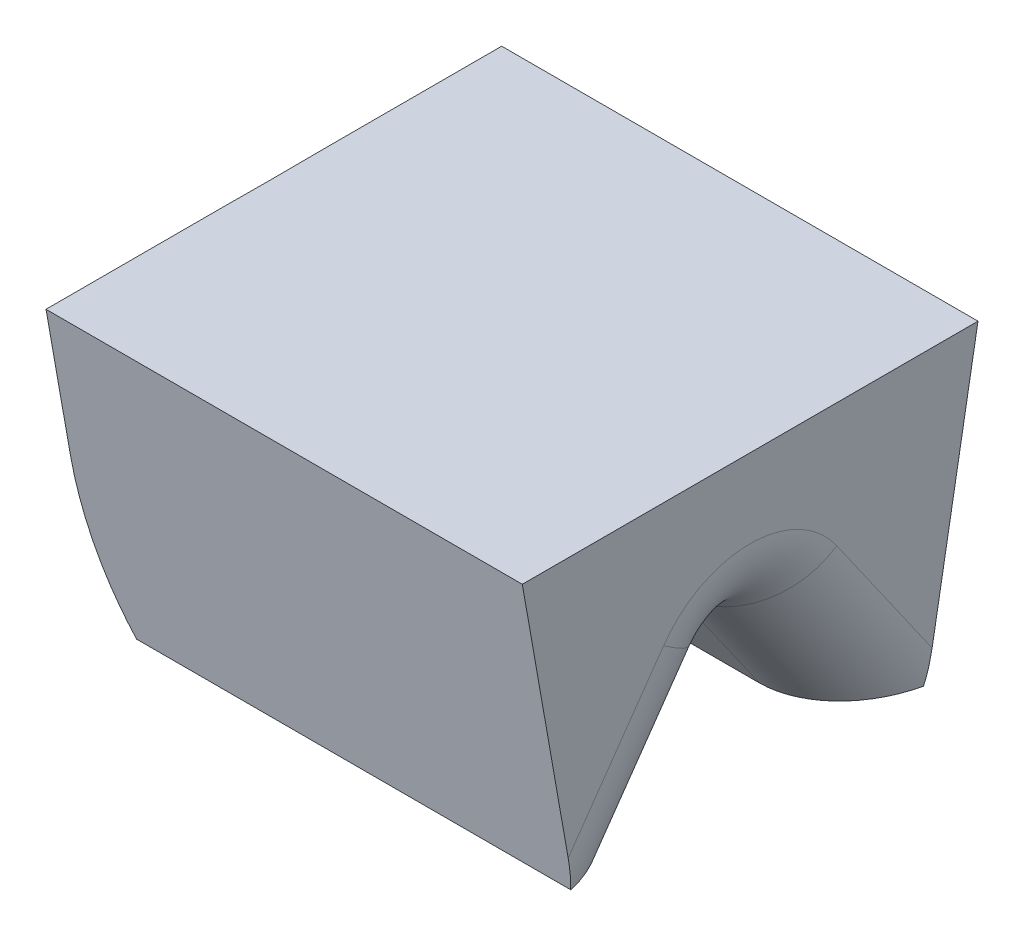
ISO-10303-21;
HEADER;
FILE_DESCRIPTION(('STEP AP214'),'2;1');
FILE_NAME('part.step','',(''),(''),'','','');
FILE_SCHEMA(('AUTOMOTIVE_DESIGN { 1 0 10303 214 1 1 1 1 }'));
ENDSEC;
DATA;
#1=APPLICATION_CONTEXT('core data for automotive mechanical design processes');
#2=APPLICATION_PROTOCOL_DEFINITION('international standard','automotive_design',2000,#1);
#3=PRODUCT_CONTEXT('',#1,'mechanical');
#4=PRODUCT('Part','Part','',(#3));
#5=PRODUCT_RELATED_PRODUCT_CATEGORY('part','',(#4));
#6=PRODUCT_DEFINITION_FORMATION('','',#4);
#7=PRODUCT_DEFINITION_CONTEXT('part definition',#1,'design');
#8=PRODUCT_DEFINITION('design','',#6,#7);
#9=PRODUCT_DEFINITION_SHAPE('','',#8);
#10=(LENGTH_UNIT() NAMED_UNIT(*) SI_UNIT(.MILLI.,.METRE.));
#11=(NAMED_UNIT(*) PLANE_ANGLE_UNIT() SI_UNIT($,.RADIAN.));
#12=(NAMED_UNIT(*) SI_UNIT($,.STERADIAN.) SOLID_ANGLE_UNIT());
#13=UNCERTAINTY_MEASURE_WITH_UNIT(LENGTH_MEASURE(1.E-05),#10,'distance_accuracy_value','');
#14=(GEOMETRIC_REPRESENTATION_CONTEXT(3) GLOBAL_UNCERTAINTY_ASSIGNED_CONTEXT((#13)) GLOBAL_UNIT_ASSIGNED_CONTEXT((#10,
#11,#12)) REPRESENTATION_CONTEXT('',''));
#15=CARTESIAN_POINT('',(0.,0.,0.));
#16=DIRECTION('',(0.,0.,1.));
#17=DIRECTION('',(1.,0.,0.));
#18=AXIS2_PLACEMENT_3D('',#15,#16,#17);
#19=CARTESIAN_POINT('',(0.,0.414017929910338,0.));
#20=DIRECTION('',(0.,1.,0.));
#21=DIRECTION('',(0.,0.,1.));
#22=AXIS2_PLACEMENT_3D('',#19,#20,#21);
#23=PLANE('',#22);
#24=DIRECTION('',(0.,0.,1.));
#25=VECTOR('',#24,1.);
#26=CARTESIAN_POINT('',(0.33782,0.414017929910338,1.50859998));
#27=LINE('',#26,#25);
#28=CARTESIAN_POINT('',(0.33782,0.414017929910338,-0.323192531540259));
#29=VERTEX_POINT('',#28);
#30=CARTESIAN_POINT('',(0.33782,0.414017929910338,0.323192531540259));
#31=VERTEX_POINT('',#30);
#32=EDGE_CURVE('E336',#29,#31,#27,.T.);
#33=ORIENTED_EDGE('',*,*,#32,.F.);
#34=DIRECTION('',(1.,0.,0.));
#35=VECTOR('',#34,1.);
#36=CARTESIAN_POINT('',(1.50859998,0.414017929910338,-0.323192531540259));
#37=LINE('',#36,#35);
#38=CARTESIAN_POINT('',(-0.33782,0.414017929910338,-0.323192531540259));
#39=VERTEX_POINT('',#38);
#40=EDGE_CURVE('E351',#39,#29,#37,.T.);
#41=ORIENTED_EDGE('',*,*,#40,.F.);
#42=DIRECTION('',(0.,0.,-1.));
#43=VECTOR('',#42,1.);
#44=CARTESIAN_POINT('',(-0.33782,0.414017929910338,1.50859998));
#45=LINE('',#44,#43);
#46=CARTESIAN_POINT('',(-0.33782,0.414017929910338,-0.0825077035762695));
#47=VERTEX_POINT('',#46);
#48=EDGE_CURVE('E62',#47,#39,#45,.T.);
#49=ORIENTED_EDGE('',*,*,#48,.F.);
#50=CARTESIAN_POINT('',(-0.33749570353375,0.414017929910338,0.));
#51=CARTESIAN_POINT('',(-0.337495660522864,0.414017929910338,-0.0220518458153848));
#52=CARTESIAN_POINT('',(-0.337688155271788,0.414017929910338,-0.0441035395169563));
#53=CARTESIAN_POINT('',(-0.33787183483216,0.414017929910338,-0.0882478906993175));
#54=CARTESIAN_POINT('',(-0.337862685909655,0.414017929910338,-0.110340555568874));
#55=CARTESIAN_POINT('',(-0.336347441005989,0.414017929910338,-0.154281729770191));
#56=CARTESIAN_POINT('',(-0.334856317925731,0.414017929910338,-0.176130471058615));
#57=CARTESIAN_POINT('',(-0.329085223221547,0.414017929910338,-0.219429911477716));
#58=CARTESIAN_POINT('',(-0.324816790168653,0.414017929910338,-0.240881881477245));
#59=CARTESIAN_POINT('',(-0.314002058345092,0.414017929910338,-0.277565089650314));
#60=CARTESIAN_POINT('',(-0.308271688176185,0.414017929910338,-0.293031140893046));
#61=CARTESIAN_POINT('',(-0.294375220052277,0.414017929910338,-0.322878059185441));
#62=CARTESIAN_POINT('',(-0.286206469239429,0.414017929910338,-0.337257722828346));
#63=CARTESIAN_POINT('',(-0.268868801637462,0.414017929910338,-0.362150487404779));
#64=CARTESIAN_POINT('',(-0.260062577684343,0.414017929910338,-0.372915390445278));
#65=CARTESIAN_POINT('',(-0.240778307008435,0.414017929910338,-0.392831780600134));
#66=CARTESIAN_POINT('',(-0.230301096354691,0.414017929910338,-0.401984069782136));
#67=CARTESIAN_POINT('',(-0.207834018261445,0.414017929910338,-0.41833767045962));
#68=CARTESIAN_POINT('',(-0.19583700797375,0.414017929910338,-0.425529227904435));
#69=CARTESIAN_POINT('',(-0.170715046820842,0.414017929910338,-0.437565182066138));
#70=CARTESIAN_POINT('',(-0.1575904567914,0.414017929910338,-0.442410326386823));
#71=CARTESIAN_POINT('',(-0.131862185634347,0.414017929910338,-0.449198255767568));
#72=CARTESIAN_POINT('',(-0.119316268609447,0.414017929910338,-0.451361157803835));
#73=CARTESIAN_POINT('',(-0.0940405595365125,0.414017929910338,-0.453451120648445));
#74=CARTESIAN_POINT('',(-0.0813108209099722,0.414017929910338,-0.453378818473274));
#75=CARTESIAN_POINT('',(-0.0565799564768648,0.414017929910338,-0.451051568832673));
#76=CARTESIAN_POINT('',(-0.0445702987551962,0.414017929910338,-0.44888582930633));
#77=CARTESIAN_POINT('',(-0.0210818521140647,0.414017929910338,-0.442588518979266));
#78=CARTESIAN_POINT('',(-0.00960297018469724,0.414017929910338,-0.438457294041514));
#79=CARTESIAN_POINT('',(0.0126433750248361,0.414017929910338,-0.428333704150697));
#80=CARTESIAN_POINT('',(0.023402224577865,0.414017929910338,-0.422322479858954));
#81=CARTESIAN_POINT('',(0.0438332133743492,0.414017929910338,-0.408671762593793));
#82=CARTESIAN_POINT('',(0.0535048072021595,0.414017929910338,-0.401031457918951));
#83=CARTESIAN_POINT('',(0.0721159581676636,0.414017929910338,-0.383887389150696));
#84=CARTESIAN_POINT('',(0.0809783845823237,0.414017929910338,-0.374300136559484));
#85=CARTESIAN_POINT('',(0.097162895713055,0.414017929910338,-0.353921843255464));
#86=CARTESIAN_POINT('',(0.104485526531551,0.414017929910338,-0.343131231409762));
#87=CARTESIAN_POINT('',(0.120166426237774,0.414017929910338,-0.316204329365787));
#88=CARTESIAN_POINT('',(0.127791258036392,0.414017929910338,-0.299640101868559));
#89=CARTESIAN_POINT('',(0.14024751892826,0.414017929910338,-0.265492924730932));
#90=CARTESIAN_POINT('',(0.14507279679865,0.414017929910338,-0.247907824502926));
#91=CARTESIAN_POINT('',(0.153789062228614,0.414017929910338,-0.20555709841812));
#92=CARTESIAN_POINT('',(0.156638136781644,0.414017929910338,-0.180588924638868));
#93=CARTESIAN_POINT('',(0.159764571322286,0.414017929910338,-0.130460581030893));
#94=CARTESIAN_POINT('',(0.160029949005095,0.414017929910338,-0.105300057715613));
#95=CARTESIAN_POINT('',(0.160007979750917,0.414017929910338,-0.0547724683251805));
#96=CARTESIAN_POINT('',(0.159715882400434,0.414017929910338,-0.0294054777035388));
#97=CARTESIAN_POINT('',(0.159678739499029,0.414017929910338,0.021282519911107));
#98=CARTESIAN_POINT('',(0.159932679639006,0.414017929910338,0.0466035248682731));
#99=CARTESIAN_POINT('',(0.160036933811411,0.414017929910338,0.0846967391398004));
#100=CARTESIAN_POINT('',(0.160024931622378,0.414017929910338,0.0974672079926935));
#101=CARTESIAN_POINT('',(0.159646665796997,0.414017929910338,0.123005790634747));
#102=CARTESIAN_POINT('',(0.159280252796576,0.414017929910338,0.135773901160751));
#103=CARTESIAN_POINT('',(0.157256408404114,0.414017929910338,0.173902993502302));
#104=CARTESIAN_POINT('',(0.154681491884959,0.414017929910338,0.199250437302187));
#105=CARTESIAN_POINT('',(0.14655303325849,0.414017929910338,0.241748352388287));
#106=CARTESIAN_POINT('',(0.142110207060326,0.414017929910338,0.259099073697439));
#107=CARTESIAN_POINT('',(0.130550529073767,0.414017929910338,0.29293938302558));
#108=CARTESIAN_POINT('',(0.123431529226645,0.414017929910338,0.309428267139568));
#109=CARTESIAN_POINT('',(0.107893755489875,0.414017929910338,0.337849550224487));
#110=CARTESIAN_POINT('',(0.0999753708345099,0.414017929910338,0.350053942935441));
#111=CARTESIAN_POINT('',(0.0822278925608702,0.414017929910338,0.372986358416263));
#112=CARTESIAN_POINT('',(0.0724003427093542,0.414017929910338,0.383715562145012));
#113=CARTESIAN_POINT('',(0.0509156982090448,0.414017929910338,0.403318239631351));
#114=CARTESIAN_POINT('',(0.0392475056891637,0.414017929910338,0.412179641030661));
#115=CARTESIAN_POINT('',(0.0144361327766832,0.414017929910338,0.427531931236));
#116=CARTESIAN_POINT('',(0.00129334110374144,0.414017929910338,0.434023442859163));
#117=CARTESIAN_POINT('',(-0.0245235647638797,0.414017929910338,0.443735734765578));
#118=CARTESIAN_POINT('',(-0.0370931833122367,0.414017929910338,0.447235458359014));
#119=CARTESIAN_POINT('',(-0.0626537089221139,0.414017929910338,0.451928939661955));
#120=CARTESIAN_POINT('',(-0.0756444028846735,0.414017929910338,0.453123845829697));
#121=CARTESIAN_POINT('',(-0.100866585272854,0.414017929910338,0.453155529834759));
#122=CARTESIAN_POINT('',(-0.113098129718334,0.414017929910338,0.452125876917185));
#123=CARTESIAN_POINT('',(-0.137211062560775,0.414017929910338,0.448019618839934));
#124=CARTESIAN_POINT('',(-0.149092482339139,0.414017929910338,0.44494319771682));
#125=CARTESIAN_POINT('',(-0.172145381492378,0.414017929910338,0.436876052264177));
#126=CARTESIAN_POINT('',(-0.183318792541168,0.414017929910338,0.431890823280221));
#127=CARTESIAN_POINT('',(-0.204717239150848,0.414017929910338,0.420192598051559));
#128=CARTESIAN_POINT('',(-0.214942216916165,0.414017929910338,0.413479496607832));
#129=CARTESIAN_POINT('',(-0.234666244572974,0.414017929910338,0.398223077145202));
#130=CARTESIAN_POINT('',(-0.244111959948666,0.414017929910338,0.389611021584832));
#131=CARTESIAN_POINT('',(-0.261582166304802,0.414017929910338,0.371052193515494));
#132=CARTESIAN_POINT('',(-0.269606028155861,0.414017929910338,0.361104833576971));
#133=CARTESIAN_POINT('',(-0.284900696261393,0.414017929910338,0.339118223734897));
#134=CARTESIAN_POINT('',(-0.292012913643135,0.414017929910338,0.326969143199586));
#135=CARTESIAN_POINT('',(-0.304458103092332,0.414017929910338,0.301808802618769));
#136=CARTESIAN_POINT('',(-0.30979128171711,0.414017929910338,0.28879764287636));
#137=CARTESIAN_POINT('',(-0.322083163331388,0.414017929910338,0.252603033491195));
#138=CARTESIAN_POINT('',(-0.327424427453381,0.414017929910338,0.228873269677599));
#139=CARTESIAN_POINT('',(-0.334522706173665,0.414017929910338,0.180900620684323));
#140=CARTESIAN_POINT('',(-0.336266139056132,0.414017929910338,0.156656138934752));
#141=CARTESIAN_POINT('',(-0.337861598811488,0.414017929910338,0.110356782115264));
#142=CARTESIAN_POINT('',(-0.337871651152376,0.414017929910338,0.0883039097131219));
#143=CARTESIAN_POINT('',(-0.33768888191445,0.414017929910338,0.0441673040170996));
#144=CARTESIAN_POINT('',(-0.337495746606524,0.414017929910338,0.0220835757326124));
#145=CARTESIAN_POINT('',(-0.33749570353375,0.414017929910338,0.));
#146=B_SPLINE_CURVE_WITH_KNOTS('',3,(#50,#51,#52,#53,#54,#55,#56,#57,#58,#59,#60,#61,#62,#63,
#64,#65,#66,#67,#68,#69,#70,#71,#72,#73,#74,#75,#76,#77,#78,#79,#80,#81,#82,#83,#84,#85,#86,#87,
#88,#89,#90,#91,#92,#93,#94,#95,#96,#97,#98,#99,#100,#101,#102,#103,#104,#105,#106,#107,#108,
#109,#110,#111,#112,#113,#114,#115,#116,#117,#118,#119,#120,#121,#122,#123,#124,#125,#126,#127,
#128,#129,#130,#131,#132,#133,#134,#135,#136,#137,#138,#139,#140,#141,#142,#143,#144,#145),
.UNSPECIFIED.,.T.,.F.,(4,2,2,2,2,2,2,2,2,2,2,2,2,2,2,2,2,2,2,2,2,2,2,2,2,2,2,2,2,2,2,2,2,2,2,2,
2,2,2,2,2,2,2,2,2,2,2,4),(0.,0.0661580738687311,0.132425652047048,0.198030443103219,
0.26336439896412,0.312667040150521,0.362023517305613,0.403571451556826,0.445098662369752,
0.486828837842477,0.528545708668938,0.566545985904629,0.604535433445336,0.640974292630856,
0.677406742105438,0.714217069457782,0.751045780868876,0.7900527639217,0.829045889375171,
0.883441304744153,0.937955790297114,1.01306837770182,1.08852914665542,1.16463581179751,
1.24060122475901,1.27890852921273,1.31723198506213,1.39339407154633,1.44695404206794,
1.50055709517175,1.54402334099659,1.58745458486166,1.63115847288969,1.67485086706753,
1.71379115992288,1.75271204435818,1.78936117978653,1.82600702032807,1.8625481434029,
1.89909149175772,1.93727845113837,1.97548226519016,2.01755557883317,2.0596240058045,
2.1321416529789,2.20493255523692,2.27108353288032,2.33733680015034),.UNSPECIFIED.);
#147=CARTESIAN_POINT('',(-0.33782,0.414017929910338,0.0825077035762695));
#148=VERTEX_POINT('',#147);
#149=EDGE_CURVE('E12',#148,#47,#146,.T.);
#150=ORIENTED_EDGE('',*,*,#149,.F.);
#151=CARTESIAN_POINT('',(-0.33782,0.414017929910338,0.323192531540259));
#152=VERTEX_POINT('',#151);
#153=EDGE_CURVE('E140',#152,#148,#45,.T.);
#154=ORIENTED_EDGE('',*,*,#153,.F.);
#155=DIRECTION('',(-1.,0.,0.));
#156=VECTOR('',#155,1.);
#157=CARTESIAN_POINT('',(1.50859998,0.414017929910338,0.323192531540259));
#158=LINE('',#157,#156);
#159=EDGE_CURVE('E153',#31,#152,#158,.T.);
#160=ORIENTED_EDGE('',*,*,#159,.F.);
#161=EDGE_LOOP('',(#33,#41,#49,#150,#154,#160));
#162=FACE_BOUND('',#161,.T.);
#163=ADVANCED_FACE('F42',(#162),#23,.T.);
#164=CARTESIAN_POINT('',(1.50859998,0.,-0.25019));
#165=DIRECTION('',(0.,-0.173648177666931,-0.984807753012208));
#166=DIRECTION('',(0.,0.984807753012208,-0.173648177666931));
#167=AXIS2_PLACEMENT_3D('',#164,#165,#166);
#168=PLANE('',#167);
#169=DIRECTION('',(0.,0.984807753012208,-0.173648177666931));
#170=VECTOR('',#169,1.);
#171=CARTESIAN_POINT('',(-0.33782,0.,-0.25019));
#172=LINE('',#171,#170);
#173=CARTESIAN_POINT('',(-0.33782,0.218365061365107,-0.288693651962728));
#174=VERTEX_POINT('',#173);
#175=EDGE_CURVE('E282',#174,#39,#172,.T.);
#176=ORIENTED_EDGE('',*,*,#175,.T.);
#177=ORIENTED_EDGE('',*,*,#40,.T.);
#178=DIRECTION('',(0.,-0.984807753012208,0.173648177666931));
#179=VECTOR('',#178,1.);
#180=CARTESIAN_POINT('',(0.33782,0.,-0.25019));
#181=LINE('',#180,#179);
#182=CARTESIAN_POINT('',(0.33782,0.0450260746646477,-0.258129311798771));
#183=VERTEX_POINT('',#182);
#184=EDGE_CURVE('E279',#29,#183,#181,.T.);
#185=ORIENTED_EDGE('',*,*,#184,.T.);
#186=CARTESIAN_POINT('',(0.21336,0.0450260746646477,-0.258129311798771));
#187=DIRECTION('',(0.,-0.173648177666931,-0.984807753012208));
#188=DIRECTION('',(0.,-0.984807753012208,0.173648177666931));
#189=AXIS2_PLACEMENT_3D('',#186,#187,#188);
#190=ELLIPSE('',#189,0.176013019972956,0.12446);
#191=CARTESIAN_POINT('',(0.333547776267921,0.,-0.25019));
#192=VERTEX_POINT('',#191);
#193=EDGE_CURVE('E318',#183,#192,#190,.T.);
#194=ORIENTED_EDGE('',*,*,#193,.T.);
#195=DIRECTION('',(-1.,0.,0.));
#196=VECTOR('',#195,1.);
#197=CARTESIAN_POINT('',(1.50859998,0.,-0.25019));
#198=LINE('',#197,#196);
#199=CARTESIAN_POINT('',(-0.282234556611779,0.,-0.25019));
#200=VERTEX_POINT('',#199);
#201=EDGE_CURVE('E287',#192,#200,#198,.T.);
#202=ORIENTED_EDGE('',*,*,#201,.T.);
#203=CARTESIAN_POINT('',(-0.0889000000000003,0.218365061365107,-0.288693651962728));
#204=DIRECTION('',(0.,-0.173648177666931,-0.984807753012208));
#205=DIRECTION('',(0.,0.984807753012208,-0.173648177666931));
#206=AXIS2_PLACEMENT_3D('',#203,#204,#205);
#207=ELLIPSE('',#206,0.352026039945911,0.24892);
#208=EDGE_CURVE('E185',#200,#174,#207,.T.);
#209=ORIENTED_EDGE('',*,*,#208,.T.);
#210=EDGE_LOOP('',(#176,#177,#185,#194,#202,#209));
#211=FACE_BOUND('',#210,.T.);
#212=ADVANCED_FACE('F224',(#211),#168,.T.);
#213=CARTESIAN_POINT('',(1.50859998,0.,0.25019));
#214=DIRECTION('',(0.,-0.173648177666931,0.984807753012208));
#215=DIRECTION('',(0.,-0.984807753012208,-0.173648177666931));
#216=AXIS2_PLACEMENT_3D('',#213,#214,#215);
#217=PLANE('',#216);
#218=DIRECTION('',(0.,0.984807753012208,0.173648177666931));
#219=VECTOR('',#218,1.);
#220=CARTESIAN_POINT('',(0.33782,0.,0.25019));
#221=LINE('',#220,#219);
#222=CARTESIAN_POINT('',(0.33782,0.0450260746646477,0.258129311798771));
#223=VERTEX_POINT('',#222);
#224=EDGE_CURVE('E271',#223,#31,#221,.T.);
#225=ORIENTED_EDGE('',*,*,#224,.T.);
#226=ORIENTED_EDGE('',*,*,#159,.T.);
#227=DIRECTION('',(0.,-0.984807753012208,-0.173648177666931));
#228=VECTOR('',#227,1.);
#229=CARTESIAN_POINT('',(-0.33782,0.,0.25019));
#230=LINE('',#229,#228);
#231=CARTESIAN_POINT('',(-0.33782,0.218365061365107,0.288693651962728));
#232=VERTEX_POINT('',#231);
#233=EDGE_CURVE('E152',#152,#232,#230,.T.);
#234=ORIENTED_EDGE('',*,*,#233,.T.);
#235=CARTESIAN_POINT('',(-0.0889000000000003,0.218365061365107,0.288693651962728));
#236=DIRECTION('',(0.,-0.173648177666931,0.984807753012208));
#237=DIRECTION('',(0.,-0.984807753012208,-0.173648177666931));
#238=AXIS2_PLACEMENT_3D('',#235,#236,#237);
#239=ELLIPSE('',#238,0.352026039945911,0.24892);
#240=CARTESIAN_POINT('',(-0.282234556611779,0.,0.25019));
#241=VERTEX_POINT('',#240);
#242=EDGE_CURVE('E168',#232,#241,#239,.T.);
#243=ORIENTED_EDGE('',*,*,#242,.T.);
#244=DIRECTION('',(-1.,0.,0.));
#245=VECTOR('',#244,1.);
#246=CARTESIAN_POINT('',(1.50859998,0.,0.25019));
#247=LINE('',#246,#245);
#248=CARTESIAN_POINT('',(0.333547776267921,0.,0.25019));
#249=VERTEX_POINT('',#248);
#250=EDGE_CURVE('E285',#249,#241,#247,.T.);
#251=ORIENTED_EDGE('',*,*,#250,.F.);
#252=CARTESIAN_POINT('',(0.21336,0.0450260746646477,0.258129311798771));
#253=DIRECTION('',(0.,-0.173648177666931,0.984807753012208));
#254=DIRECTION('',(0.,0.984807753012208,0.173648177666931));
#255=AXIS2_PLACEMENT_3D('',#252,#253,#254);
#256=ELLIPSE('',#255,0.176013019972956,0.12446);
#257=EDGE_CURVE('E330',#249,#223,#256,.T.);
#258=ORIENTED_EDGE('',*,*,#257,.T.);
#259=EDGE_LOOP('',(#225,#226,#234,#243,#251,#258));
#260=FACE_BOUND('',#259,.T.);
#261=ADVANCED_FACE('F254',(#260),#217,.T.);
#262=CARTESIAN_POINT('',(-0.33782,0.88916002,1.50859998));
#263=DIRECTION('',(-1.,0.,0.));
#264=DIRECTION('',(0.,-1.,0.));
#265=AXIS2_PLACEMENT_3D('',#262,#263,#264);
#266=PLANE('',#265);
#267=ORIENTED_EDGE('',*,*,#233,.F.);
#268=ORIENTED_EDGE('',*,*,#153,.T.);
#269=CARTESIAN_POINT('',(-0.33782,0.1524,0.));
#270=DIRECTION('',(-1.,0.,0.));
#271=DIRECTION('',(0.,-1.,0.));
#272=AXIS2_PLACEMENT_3D('',#269,#270,#271);
#273=CIRCLE('',#272,0.27432);
#274=CARTESIAN_POINT('',(-0.33782,0.309743488019818,0.224709788789357));
#275=VERTEX_POINT('',#274);
#276=EDGE_CURVE('E150',#148,#275,#273,.F.);
#277=ORIENTED_EDGE('',*,*,#276,.T.);
#278=DIRECTION('',(0.,0.819152044288993,-0.573576436351044));
#279=VECTOR('',#278,1.);
#280=CARTESIAN_POINT('',(-0.33782,0.142774646536502,0.341622630242116));
#281=LINE('',#280,#279);
#282=EDGE_CURVE('E162',#275,#232,#281,.F.);
#283=ORIENTED_EDGE('',*,*,#282,.T.);
#284=EDGE_LOOP('',(#267,#268,#277,#283));
#285=FACE_BOUND('',#284,.T.);
#286=ADVANCED_FACE('F148',(#285),#266,.T.);
#287=CARTESIAN_POINT('',(-0.33782,0.309743488019818,-0.224709788789357));
#288=VERTEX_POINT('',#287);
#289=EDGE_CURVE('E159',#288,#47,#273,.F.);
#290=ORIENTED_EDGE('',*,*,#289,.T.);
#291=ORIENTED_EDGE('',*,*,#48,.T.);
#292=ORIENTED_EDGE('',*,*,#175,.F.);
#293=DIRECTION('',(0.,-0.819152044288994,-0.573576436351044));
#294=VECTOR('',#293,1.);
#295=CARTESIAN_POINT('',(-0.33782,0.309743488019818,-0.224709788789357));
#296=LINE('',#295,#294);
#297=EDGE_CURVE('E160',#174,#288,#296,.F.);
#298=ORIENTED_EDGE('',*,*,#297,.T.);
#299=EDGE_LOOP('',(#290,#291,#292,#298));
#300=FACE_BOUND('',#299,.T.);
#301=ADVANCED_FACE('F357',(#300),#266,.T.);
#302=CARTESIAN_POINT('',(0.33782,-0.00999998,1.50859998));
#303=DIRECTION('',(1.,0.,0.));
#304=DIRECTION('',(0.,1.,0.));
#305=AXIS2_PLACEMENT_3D('',#302,#303,#304);
#306=PLANE('',#305);
#307=ORIENTED_EDGE('',*,*,#184,.F.);
#308=ORIENTED_EDGE('',*,*,#32,.T.);
#309=ORIENTED_EDGE('',*,*,#224,.F.);
#310=DIRECTION('',(0.,-0.819152044288993,0.573576436351044));
#311=VECTOR('',#310,1.);
#312=CARTESIAN_POINT('',(0.33782,0.238356164751567,0.122758125357149));
#313=LINE('',#312,#311);
#314=CARTESIAN_POINT('',(0.33782,0.238356164751567,0.122758125357149));
#315=VERTEX_POINT('',#314);
#316=EDGE_CURVE('E344',#223,#315,#313,.F.);
#317=ORIENTED_EDGE('',*,*,#316,.T.);
#318=CARTESIAN_POINT('',(0.33782,0.1524,0.));
#319=DIRECTION('',(1.,0.,0.));
#320=DIRECTION('',(0.,1.,0.));
#321=AXIS2_PLACEMENT_3D('',#318,#319,#320);
#322=CIRCLE('',#321,0.14986);
#323=CARTESIAN_POINT('',(0.33782,0.238356164751567,-0.122758125357149));
#324=VERTEX_POINT('',#323);
#325=EDGE_CURVE('E341',#315,#324,#322,.F.);
#326=ORIENTED_EDGE('',*,*,#325,.T.);
#327=DIRECTION('',(0.,0.819152044288994,0.573576436351044));
#328=VECTOR('',#327,1.);
#329=CARTESIAN_POINT('',(0.33782,0.0713873232682507,-0.239670966809908));
#330=LINE('',#329,#328);
#331=EDGE_CURVE('E321',#324,#183,#330,.F.);
#332=ORIENTED_EDGE('',*,*,#331,.T.);
#333=EDGE_LOOP('',(#307,#308,#309,#317,#326,#332));
#334=FACE_BOUND('',#333,.T.);
#335=ADVANCED_FACE('F234',(#334),#306,.T.);
#336=CARTESIAN_POINT('',(-0.0889000000000003,0.1524,0.));
#337=DIRECTION('',(-1.,0.,0.));
#338=DIRECTION('',(0.,-1.,0.));
#339=AXIS2_PLACEMENT_3D('',#336,#337,#338);
#340=TOROIDAL_SURFACE('',#339,0.27432,0.24892);
#341=ORIENTED_EDGE('',*,*,#276,.F.);
#342=ORIENTED_EDGE('',*,*,#149,.T.);
#343=ORIENTED_EDGE('',*,*,#289,.F.);
#344=CARTESIAN_POINT('',(-0.0889000000000002,0.309743488019818,-0.224709788789357));
#345=DIRECTION('',(0.,0.819152044288994,0.573576436351042));
#346=DIRECTION('',(0.,-0.573576436351042,0.819152044288994));
#347=AXIS2_PLACEMENT_3D('',#344,#345,#346);
#348=CIRCLE('',#347,0.24892);
#349=CARTESIAN_POINT('',(-0.0889000000000003,0.166968841483316,-0.0208064619249405));
#350=VERTEX_POINT('',#349);
#351=EDGE_CURVE('E191',#288,#350,#348,.T.);
#352=ORIENTED_EDGE('',*,*,#351,.T.);
#353=CARTESIAN_POINT('',(-0.0889000000000003,0.1524,0.));
#354=DIRECTION('',(-1.,0.,0.));
#355=DIRECTION('',(0.,-1.,0.));
#356=AXIS2_PLACEMENT_3D('',#353,#354,#355);
#357=CIRCLE('',#356,0.0254000000000001);
#358=CARTESIAN_POINT('',(-0.0889000000000003,0.166968841483316,0.0208064619249405));
#359=VERTEX_POINT('',#358);
#360=EDGE_CURVE('E173',#359,#350,#357,.T.);
#361=ORIENTED_EDGE('',*,*,#360,.F.);
#362=CARTESIAN_POINT('',(-0.0889000000000002,0.309743488019818,0.224709788789357));
#363=DIRECTION('',(0.,-0.819152044288993,0.573576436351044));
#364=DIRECTION('',(0.,-0.573576436351044,-0.819152044288994));
#365=AXIS2_PLACEMENT_3D('',#362,#363,#364);
#366=CIRCLE('',#365,0.24892);
#367=EDGE_CURVE('E158',#275,#359,#366,.T.);
#368=ORIENTED_EDGE('',*,*,#367,.F.);
#369=EDGE_LOOP('',(#341,#342,#343,#352,#361,#368));
#370=FACE_BOUND('',#369,.T.);
#371=ADVANCED_FACE('F156',(#370),#340,.T.);
#372=CARTESIAN_POINT('',(0.,0.,0.));
#373=DIRECTION('',(0.,1.,0.));
#374=DIRECTION('',(0.,0.,1.));
#375=AXIS2_PLACEMENT_3D('',#372,#373,#374);
#376=PLANE('',#375);
#377=ORIENTED_EDGE('',*,*,#201,.F.);
#378=CARTESIAN_POINT('',(0.21336,0.,-0.289656908694951));
#379=DIRECTION('',(0.,1.,0.));
#380=DIRECTION('',(0.,0.,-1.));
#381=AXIS2_PLACEMENT_3D('',#378,#379,#380);
#382=ELLIPSE('',#381,0.15193760531725,0.12446);
#383=CARTESIAN_POINT('',(0.21336,0.,-0.1377193033777));
#384=VERTEX_POINT('',#383);
#385=EDGE_CURVE('E315',#192,#384,#382,.F.);
#386=ORIENTED_EDGE('',*,*,#385,.T.);
#387=CARTESIAN_POINT('',(0.21336,0.,-0.1377193033777));
#388=DIRECTION('',(-1.,0.,0.));
#389=VECTOR('',#388,1.);
#390=LINE('',#387,#389);
#391=CARTESIAN_POINT('',(-0.0889000000000003,0.,-0.1377193033777));
#392=VERTEX_POINT('',#391);
#393=EDGE_CURVE('E200',#384,#392,#390,.T.);
#394=ORIENTED_EDGE('',*,*,#393,.T.);
#395=CARTESIAN_POINT('',(-0.0889000000000002,0.,-0.441594514012201));
#396=DIRECTION('',(0.,1.,0.));
#397=DIRECTION('',(0.,0.,1.));
#398=AXIS2_PLACEMENT_3D('',#395,#396,#397);
#399=ELLIPSE('',#398,0.303875210634501,0.24892);
#400=EDGE_CURVE('E180',#392,#200,#399,.F.);
#401=ORIENTED_EDGE('',*,*,#400,.T.);
#402=EDGE_LOOP('',(#377,#386,#394,#401));
#403=FACE_BOUND('',#402,.T.);
#404=ADVANCED_FACE('F223',(#403),#376,.F.);
#405=CARTESIAN_POINT('',(-0.0889000000000002,0.,0.1377193033777));
#406=DIRECTION('',(1.,0.,0.));
#407=VECTOR('',#406,1.);
#408=LINE('',#405,#407);
#409=CARTESIAN_POINT('',(-0.0889000000000002,0.,0.1377193033777));
#410=VERTEX_POINT('',#409);
#411=CARTESIAN_POINT('',(0.21336,0.,0.1377193033777));
#412=VERTEX_POINT('',#411);
#413=EDGE_CURVE('E288',#410,#412,#408,.T.);
#414=ORIENTED_EDGE('',*,*,#413,.T.);
#415=CARTESIAN_POINT('',(0.21336,0.,0.289656908694951));
#416=DIRECTION('',(0.,1.,0.));
#417=DIRECTION('',(0.,0.,-1.));
#418=AXIS2_PLACEMENT_3D('',#415,#416,#417);
#419=ELLIPSE('',#418,0.151937605317251,0.12446);
#420=EDGE_CURVE('E69',#412,#249,#419,.F.);
#421=ORIENTED_EDGE('',*,*,#420,.T.);
#422=ORIENTED_EDGE('',*,*,#250,.T.);
#423=CARTESIAN_POINT('',(-0.0889000000000003,0.,0.441594514012201));
#424=DIRECTION('',(0.,1.,0.));
#425=DIRECTION('',(0.,0.,1.));
#426=AXIS2_PLACEMENT_3D('',#423,#424,#425);
#427=ELLIPSE('',#426,0.303875210634501,0.24892);
#428=EDGE_CURVE('E171',#241,#410,#427,.F.);
#429=ORIENTED_EDGE('',*,*,#428,.T.);
#430=EDGE_LOOP('',(#414,#421,#422,#429));
#431=FACE_BOUND('',#430,.T.);
#432=ADVANCED_FACE('F212',(#431),#376,.F.);
#433=CARTESIAN_POINT('',(-1.20142,0.166968841483316,-0.0208064619249405));
#434=DIRECTION('',(0.,0.573576436351044,-0.819152044288993));
#435=DIRECTION('',(0.,0.819152044288994,0.573576436351044));
#436=AXIS2_PLACEMENT_3D('',#433,#434,#435);
#437=PLANE('',#436);
#438=ORIENTED_EDGE('',*,*,#393,.F.);
#439=DIRECTION('',(0.,0.819152044288994,0.573576436351044));
#440=VECTOR('',#439,1.);
#441=CARTESIAN_POINT('',(0.21336,0.166968841483316,-0.0208064619249405));
#442=LINE('',#441,#440);
#443=CARTESIAN_POINT('',(0.21336,0.166968841483316,-0.0208064619249405));
#444=VERTEX_POINT('',#443);
#445=EDGE_CURVE('E189',#384,#444,#442,.T.);
#446=ORIENTED_EDGE('',*,*,#445,.T.);
#447=DIRECTION('',(1.,0.,0.));
#448=VECTOR('',#447,1.);
#449=CARTESIAN_POINT('',(-1.20142,0.166968841483316,-0.0208064619249405));
#450=LINE('',#449,#448);
#451=EDGE_CURVE('E195',#350,#444,#450,.T.);
#452=ORIENTED_EDGE('',*,*,#451,.F.);
#453=DIRECTION('',(0.,-0.819152044288994,-0.573576436351044));
#454=VECTOR('',#453,1.);
#455=CARTESIAN_POINT('',(-0.0889000000000003,0.,-0.1377193033777));
#456=LINE('',#455,#454);
#457=EDGE_CURVE('E177',#350,#392,#456,.T.);
#458=ORIENTED_EDGE('',*,*,#457,.T.);
#459=EDGE_LOOP('',(#438,#446,#452,#458));
#460=FACE_BOUND('',#459,.T.);
#461=ADVANCED_FACE('F222',(#460),#437,.F.);
#462=CARTESIAN_POINT('',(-1.20142,-0.00999998000000012,0.144721364755646));
#463=DIRECTION('',(0.,0.573576436351044,0.819152044288993));
#464=DIRECTION('',(0.,-0.819152044288993,0.573576436351044));
#465=AXIS2_PLACEMENT_3D('',#462,#463,#464);
#466=PLANE('',#465);
#467=DIRECTION('',(1.,0.,0.));
#468=VECTOR('',#467,1.);
#469=CARTESIAN_POINT('',(-1.20142,0.166968841483316,0.0208064619249405));
#470=LINE('',#469,#468);
#471=CARTESIAN_POINT('',(0.21336,0.166968841483316,0.0208064619249405));
#472=VERTEX_POINT('',#471);
#473=EDGE_CURVE('E280',#359,#472,#470,.T.);
#474=ORIENTED_EDGE('',*,*,#473,.T.);
#475=DIRECTION('',(0.,-0.819152044288993,0.573576436351044));
#476=VECTOR('',#475,1.);
#477=CARTESIAN_POINT('',(0.21336,0.,0.1377193033777));
#478=LINE('',#477,#476);
#479=EDGE_CURVE('E299',#472,#412,#478,.T.);
#480=ORIENTED_EDGE('',*,*,#479,.T.);
#481=ORIENTED_EDGE('',*,*,#413,.F.);
#482=DIRECTION('',(0.,0.819152044288993,-0.573576436351044));
#483=VECTOR('',#482,1.);
#484=CARTESIAN_POINT('',(-0.0889000000000003,0.166968841483316,0.0208064619249406));
#485=LINE('',#484,#483);
#486=EDGE_CURVE('E163',#410,#359,#485,.T.);
#487=ORIENTED_EDGE('',*,*,#486,.T.);
#488=EDGE_LOOP('',(#474,#480,#481,#487));
#489=FACE_BOUND('',#488,.T.);
#490=ADVANCED_FACE('F261',(#489),#466,.F.);
#491=CARTESIAN_POINT('',(-1.20142,0.1524,0.));
#492=DIRECTION('',(1.,0.,0.));
#493=DIRECTION('',(0.,0.,-1.));
#494=AXIS2_PLACEMENT_3D('',#491,#492,#493);
#495=CYLINDRICAL_SURFACE('',#494,0.0254000000000001);
#496=ORIENTED_EDGE('',*,*,#451,.T.);
#497=CARTESIAN_POINT('',(0.21336,0.1524,0.));
#498=DIRECTION('',(1.,0.,0.));
#499=DIRECTION('',(0.,1.,0.));
#500=AXIS2_PLACEMENT_3D('',#497,#498,#499);
#501=CIRCLE('',#500,0.0254000000000001);
#502=EDGE_CURVE('E55',#444,#472,#501,.T.);
#503=ORIENTED_EDGE('',*,*,#502,.T.);
#504=ORIENTED_EDGE('',*,*,#473,.F.);
#505=ORIENTED_EDGE('',*,*,#360,.T.);
#506=EDGE_LOOP('',(#496,#503,#504,#505));
#507=FACE_BOUND('',#506,.T.);
#508=ADVANCED_FACE('F237',(#507),#495,.F.);
#509=CARTESIAN_POINT('',(-0.0889000000000003,0.309743488019818,-0.224709788789357));
#510=DIRECTION('',(0.,0.819152044288994,0.573576436351044));
#511=DIRECTION('',(0.,-0.573576436351044,0.819152044288993));
#512=AXIS2_PLACEMENT_3D('',#509,#510,#511);
#513=CYLINDRICAL_SURFACE('',#512,0.24892);
#514=ORIENTED_EDGE('',*,*,#400,.F.);
#515=ORIENTED_EDGE('',*,*,#457,.F.);
#516=ORIENTED_EDGE('',*,*,#351,.F.);
#517=ORIENTED_EDGE('',*,*,#297,.F.);
#518=ORIENTED_EDGE('',*,*,#208,.F.);
#519=EDGE_LOOP('',(#514,#515,#516,#517,#518));
#520=FACE_BOUND('',#519,.T.);
#521=ADVANCED_FACE('F229',(#520),#513,.T.);
#522=CARTESIAN_POINT('',(-0.0889000000000003,0.132774666536502,0.348624691620063));
#523=DIRECTION('',(0.,-0.819152044288993,0.573576436351044));
#524=DIRECTION('',(0.,-0.573576436351044,-0.819152044288993));
#525=AXIS2_PLACEMENT_3D('',#522,#523,#524);
#526=CYLINDRICAL_SURFACE('',#525,0.24892);
#527=ORIENTED_EDGE('',*,*,#242,.F.);
#528=ORIENTED_EDGE('',*,*,#282,.F.);
#529=ORIENTED_EDGE('',*,*,#367,.T.);
#530=ORIENTED_EDGE('',*,*,#486,.F.);
#531=ORIENTED_EDGE('',*,*,#428,.F.);
#532=EDGE_LOOP('',(#527,#528,#529,#530,#531));
#533=FACE_BOUND('',#532,.T.);
#534=ADVANCED_FACE('F226',(#533),#526,.T.);
#535=CARTESIAN_POINT('',(0.21336,0.0613873432682507,0.246673028187855));
#536=DIRECTION('',(0.,0.819152044288993,-0.573576436351044));
#537=DIRECTION('',(0.,0.573576436351044,0.819152044288993));
#538=AXIS2_PLACEMENT_3D('',#535,#536,#537);
#539=CYLINDRICAL_SURFACE('',#538,0.12446);
#540=ORIENTED_EDGE('',*,*,#420,.F.);
#541=ORIENTED_EDGE('',*,*,#479,.F.);
#542=CARTESIAN_POINT('',(0.21336,0.238356164751567,0.122758125357149));
#543=DIRECTION('',(0.,0.819152044288994,-0.573576436351044));
#544=DIRECTION('',(0.,0.573576436351044,0.819152044288994));
#545=AXIS2_PLACEMENT_3D('',#542,#543,#544);
#546=CIRCLE('',#545,0.12446);
#547=EDGE_CURVE('E192',#315,#472,#546,.T.);
#548=ORIENTED_EDGE('',*,*,#547,.F.);
#549=ORIENTED_EDGE('',*,*,#316,.F.);
#550=ORIENTED_EDGE('',*,*,#257,.F.);
#551=EDGE_LOOP('',(#540,#541,#548,#549,#550));
#552=FACE_BOUND('',#551,.T.);
#553=ADVANCED_FACE('F44',(#552),#539,.T.);
#554=CARTESIAN_POINT('',(0.21336,0.1524,0.));
#555=DIRECTION('',(1.,0.,0.));
#556=DIRECTION('',(0.,1.,0.));
#557=AXIS2_PLACEMENT_3D('',#554,#555,#556);
#558=TOROIDAL_SURFACE('',#557,0.14986,0.12446);
#559=ORIENTED_EDGE('',*,*,#547,.T.);
#560=ORIENTED_EDGE('',*,*,#502,.F.);
#561=CARTESIAN_POINT('',(0.21336,0.238356164751567,-0.122758125357149));
#562=DIRECTION('',(0.,-0.819152044288993,-0.573576436351044));
#563=DIRECTION('',(0.,0.573576436351044,-0.819152044288994));
#564=AXIS2_PLACEMENT_3D('',#561,#562,#563);
#565=CIRCLE('',#564,0.12446);
#566=EDGE_CURVE('E335',#324,#444,#565,.T.);
#567=ORIENTED_EDGE('',*,*,#566,.F.);
#568=ORIENTED_EDGE('',*,*,#325,.F.);
#569=EDGE_LOOP('',(#559,#560,#567,#568));
#570=FACE_BOUND('',#569,.T.);
#571=ADVANCED_FACE('F241',(#570),#558,.T.);
#572=CARTESIAN_POINT('',(0.21336,0.238356164751567,-0.122758125357149));
#573=DIRECTION('',(0.,-0.819152044288994,-0.573576436351044));
#574=DIRECTION('',(0.,0.573576436351044,-0.819152044288993));
#575=AXIS2_PLACEMENT_3D('',#572,#573,#574);
#576=CYLINDRICAL_SURFACE('',#575,0.12446);
#577=ORIENTED_EDGE('',*,*,#193,.F.);
#578=ORIENTED_EDGE('',*,*,#331,.F.);
#579=ORIENTED_EDGE('',*,*,#566,.T.);
#580=ORIENTED_EDGE('',*,*,#445,.F.);
#581=ORIENTED_EDGE('',*,*,#385,.F.);
#582=EDGE_LOOP('',(#577,#578,#579,#580,#581));
#583=FACE_BOUND('',#582,.T.);
#584=ADVANCED_FACE('F239',(#583),#576,.T.);
#585=CLOSED_SHELL('',(#163,#212,#261,#286,#301,#335,#371,#404,#432,#461,#490,#508,#521,#534,
#553,#571,#584));
#586=MANIFOLD_SOLID_BREP('B2',#585);
#587=ADVANCED_BREP_SHAPE_REPRESENTATION('',(#18,#586),#14);
#588=SHAPE_DEFINITION_REPRESENTATION(#9,#587);
ENDSEC;
END-ISO-10303-21;
